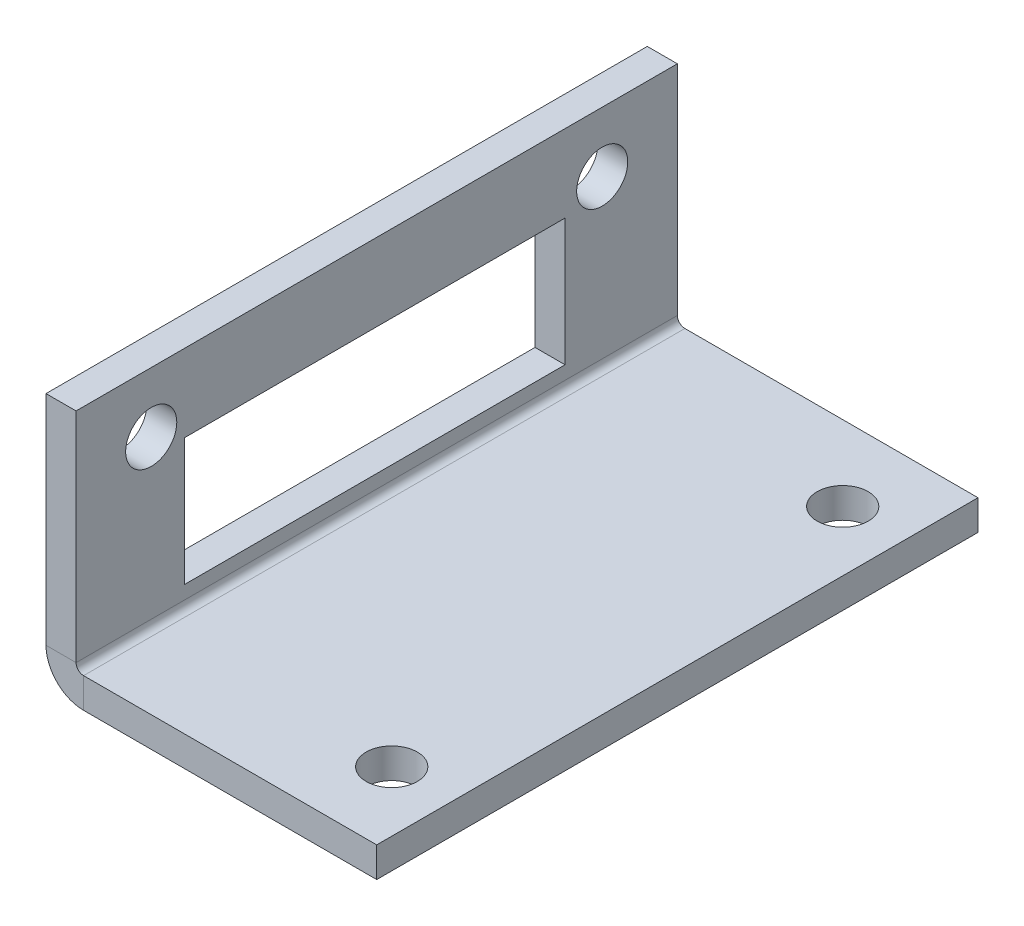
ISO-10303-21;
HEADER;
FILE_DESCRIPTION(('STEP AP214'),'2;1');
FILE_NAME('part.step','',(''),(''),'','','');
FILE_SCHEMA(('AUTOMOTIVE_DESIGN { 1 0 10303 214 1 1 1 1 }'));
ENDSEC;
DATA;
#1=APPLICATION_CONTEXT('core data for automotive mechanical design processes');
#2=APPLICATION_PROTOCOL_DEFINITION('international standard','automotive_design',2000,#1);
#3=PRODUCT_CONTEXT('',#1,'mechanical');
#4=PRODUCT('Part','Part','',(#3));
#5=PRODUCT_RELATED_PRODUCT_CATEGORY('part','',(#4));
#6=PRODUCT_DEFINITION_FORMATION('','',#4);
#7=PRODUCT_DEFINITION_CONTEXT('part definition',#1,'design');
#8=PRODUCT_DEFINITION('design','',#6,#7);
#9=PRODUCT_DEFINITION_SHAPE('','',#8);
#10=(LENGTH_UNIT() NAMED_UNIT(*) SI_UNIT(.MILLI.,.METRE.));
#11=(NAMED_UNIT(*) PLANE_ANGLE_UNIT() SI_UNIT($,.RADIAN.));
#12=(NAMED_UNIT(*) SI_UNIT($,.STERADIAN.) SOLID_ANGLE_UNIT());
#13=UNCERTAINTY_MEASURE_WITH_UNIT(LENGTH_MEASURE(1.E-05),#10,'distance_accuracy_value','');
#14=(GEOMETRIC_REPRESENTATION_CONTEXT(3) GLOBAL_UNCERTAINTY_ASSIGNED_CONTEXT((#13)) GLOBAL_UNIT_ASSIGNED_CONTEXT((#10,
#11,#12)) REPRESENTATION_CONTEXT('',''));
#15=CARTESIAN_POINT('',(0.,0.,0.));
#16=DIRECTION('',(0.,0.,1.));
#17=DIRECTION('',(1.,0.,0.));
#18=AXIS2_PLACEMENT_3D('',#15,#16,#17);
#19=CARTESIAN_POINT('',(0.5,0.,40.));
#20=DIRECTION('',(0.,0.,1.));
#21=DIRECTION('',(1.,0.,0.));
#22=AXIS2_PLACEMENT_3D('',#19,#20,#21);
#23=PLANE('',#22);
#24=DIRECTION('',(0.,-1.,0.));
#25=VECTOR('',#24,1.);
#26=CARTESIAN_POINT('',(0.5,0.,40.));
#27=LINE('',#26,#25);
#28=CARTESIAN_POINT('',(0.5,0.,40.));
#29=VERTEX_POINT('',#28);
#30=CARTESIAN_POINT('',(0.5,-2.,40.));
#31=VERTEX_POINT('',#30);
#32=EDGE_CURVE('E11',#29,#31,#27,.T.);
#33=ORIENTED_EDGE('',*,*,#32,.F.);
#34=CARTESIAN_POINT('',(0.5,0.5,40.));
#35=DIRECTION('',(0.,0.,-1.));
#36=DIRECTION('',(-1.,0.,0.));
#37=AXIS2_PLACEMENT_3D('',#34,#35,#36);
#38=CIRCLE('',#37,0.5);
#39=CARTESIAN_POINT('',(0.,0.5,40.));
#40=VERTEX_POINT('',#39);
#41=EDGE_CURVE('E192',#40,#29,#38,.F.);
#42=ORIENTED_EDGE('',*,*,#41,.F.);
#43=DIRECTION('',(1.,0.,0.));
#44=VECTOR('',#43,1.);
#45=CARTESIAN_POINT('',(-2.,0.5,40.));
#46=LINE('',#45,#44);
#47=CARTESIAN_POINT('',(-2.,0.5,40.));
#48=VERTEX_POINT('',#47);
#49=EDGE_CURVE('E48',#48,#40,#46,.T.);
#50=ORIENTED_EDGE('',*,*,#49,.F.);
#51=CARTESIAN_POINT('',(0.5,0.5,40.));
#52=DIRECTION('',(0.,0.,1.));
#53=DIRECTION('',(1.,0.,0.));
#54=AXIS2_PLACEMENT_3D('',#51,#52,#53);
#55=CIRCLE('',#54,2.5);
#56=EDGE_CURVE('E204',#48,#31,#55,.T.);
#57=ORIENTED_EDGE('',*,*,#56,.T.);
#58=EDGE_LOOP('',(#33,#42,#50,#57));
#59=FACE_BOUND('',#58,.T.);
#60=ADVANCED_FACE('F40',(#59),#23,.T.);
#61=CARTESIAN_POINT('',(-2.,0.5,40.));
#62=DIRECTION('',(0.,0.,1.));
#63=DIRECTION('',(1.,0.,0.));
#64=AXIS2_PLACEMENT_3D('',#61,#62,#63);
#65=PLANE('',#64);
#66=DIRECTION('',(1.,0.,0.));
#67=VECTOR('',#66,1.);
#68=CARTESIAN_POINT('',(0.,0.,40.));
#69=LINE('',#68,#67);
#70=CARTESIAN_POINT('',(20.,0.,40.));
#71=VERTEX_POINT('',#70);
#72=EDGE_CURVE('E189',#29,#71,#69,.T.);
#73=ORIENTED_EDGE('',*,*,#72,.F.);
#74=ORIENTED_EDGE('',*,*,#32,.T.);
#75=DIRECTION('',(1.,0.,0.));
#76=VECTOR('',#75,1.);
#77=CARTESIAN_POINT('',(0.,-2.,40.));
#78=LINE('',#77,#76);
#79=CARTESIAN_POINT('',(20.,-2.,40.));
#80=VERTEX_POINT('',#79);
#81=EDGE_CURVE('E183',#31,#80,#78,.T.);
#82=ORIENTED_EDGE('',*,*,#81,.T.);
#83=DIRECTION('',(0.,-1.,0.));
#84=VECTOR('',#83,1.);
#85=CARTESIAN_POINT('',(20.,0.,40.));
#86=LINE('',#85,#84);
#87=EDGE_CURVE('E185',#71,#80,#86,.T.);
#88=ORIENTED_EDGE('',*,*,#87,.F.);
#89=EDGE_LOOP('',(#73,#74,#82,#88));
#90=FACE_BOUND('',#89,.T.);
#91=ADVANCED_FACE('F277',(#90),#65,.T.);
#92=CARTESIAN_POINT('',(0.,0.5,0.));
#93=DIRECTION('',(0.,0.,-1.));
#94=DIRECTION('',(-1.,0.,0.));
#95=AXIS2_PLACEMENT_3D('',#92,#93,#94);
#96=PLANE('',#95);
#97=DIRECTION('',(-1.,0.,0.));
#98=VECTOR('',#97,1.);
#99=CARTESIAN_POINT('',(0.,0.5,0.));
#100=LINE('',#99,#98);
#101=CARTESIAN_POINT('',(0.,0.5,0.));
#102=VERTEX_POINT('',#101);
#103=CARTESIAN_POINT('',(-2.,0.5,0.));
#104=VERTEX_POINT('',#103);
#105=EDGE_CURVE('E252',#102,#104,#100,.T.);
#106=ORIENTED_EDGE('',*,*,#105,.F.);
#107=CARTESIAN_POINT('',(0.5,0.5,0.));
#108=DIRECTION('',(0.,0.,-1.));
#109=DIRECTION('',(-1.,0.,0.));
#110=AXIS2_PLACEMENT_3D('',#107,#108,#109);
#111=CIRCLE('',#110,0.5);
#112=CARTESIAN_POINT('',(0.5,0.,0.));
#113=VERTEX_POINT('',#112);
#114=EDGE_CURVE('E217',#102,#113,#111,.F.);
#115=ORIENTED_EDGE('',*,*,#114,.T.);
#116=DIRECTION('',(0.,1.,0.));
#117=VECTOR('',#116,1.);
#118=CARTESIAN_POINT('',(0.5,-2.,0.));
#119=LINE('',#118,#117);
#120=CARTESIAN_POINT('',(0.5,-2.,0.));
#121=VERTEX_POINT('',#120);
#122=EDGE_CURVE('E250',#121,#113,#119,.T.);
#123=ORIENTED_EDGE('',*,*,#122,.F.);
#124=CARTESIAN_POINT('',(0.5,0.5,0.));
#125=DIRECTION('',(0.,0.,1.));
#126=DIRECTION('',(1.,0.,0.));
#127=AXIS2_PLACEMENT_3D('',#124,#125,#126);
#128=CIRCLE('',#127,2.5);
#129=EDGE_CURVE('E186',#104,#121,#128,.T.);
#130=ORIENTED_EDGE('',*,*,#129,.F.);
#131=EDGE_LOOP('',(#106,#115,#123,#130));
#132=FACE_BOUND('',#131,.T.);
#133=ADVANCED_FACE('F282',(#132),#96,.T.);
#134=CARTESIAN_POINT('',(0.5,-2.,0.));
#135=DIRECTION('',(0.,0.,-1.));
#136=DIRECTION('',(-1.,0.,0.));
#137=AXIS2_PLACEMENT_3D('',#134,#135,#136);
#138=PLANE('',#137);
#139=DIRECTION('',(0.,-1.,0.));
#140=VECTOR('',#139,1.);
#141=CARTESIAN_POINT('',(0.,0.,0.));
#142=LINE('',#141,#140);
#143=CARTESIAN_POINT('',(0.,15.,0.));
#144=VERTEX_POINT('',#143);
#145=EDGE_CURVE('E220',#144,#102,#142,.T.);
#146=ORIENTED_EDGE('',*,*,#145,.T.);
#147=ORIENTED_EDGE('',*,*,#105,.T.);
#148=DIRECTION('',(0.,1.,0.));
#149=VECTOR('',#148,1.);
#150=CARTESIAN_POINT('',(-2.,0.,0.));
#151=LINE('',#150,#149);
#152=CARTESIAN_POINT('',(-2.,15.,0.));
#153=VERTEX_POINT('',#152);
#154=EDGE_CURVE('E226',#153,#104,#151,.F.);
#155=ORIENTED_EDGE('',*,*,#154,.F.);
#156=DIRECTION('',(1.,0.,0.));
#157=VECTOR('',#156,1.);
#158=CARTESIAN_POINT('',(-2.,15.,0.));
#159=LINE('',#158,#157);
#160=EDGE_CURVE('E223',#153,#144,#159,.T.);
#161=ORIENTED_EDGE('',*,*,#160,.T.);
#162=EDGE_LOOP('',(#146,#147,#155,#161));
#163=FACE_BOUND('',#162,.T.);
#164=ADVANCED_FACE('F325',(#163),#138,.T.);
#165=CARTESIAN_POINT('',(0.,-2.,40.));
#166=DIRECTION('',(0.,1.,0.));
#167=DIRECTION('',(0.,0.,1.));
#168=AXIS2_PLACEMENT_3D('',#165,#166,#167);
#169=PLANE('',#168);
#170=CARTESIAN_POINT('',(16.,-2.,5.));
#171=DIRECTION('',(0.,1.,0.));
#172=DIRECTION('',(0.,0.,1.));
#173=AXIS2_PLACEMENT_3D('',#170,#171,#172);
#174=CIRCLE('',#173,1.7);
#175=CARTESIAN_POINT('',(16.,-2.,6.7));
#176=VERTEX_POINT('',#175);
#177=EDGE_CURVE('E173',#176,#176,#174,.T.);
#178=ORIENTED_EDGE('',*,*,#177,.T.);
#179=EDGE_LOOP('',(#178));
#180=FACE_BOUND('',#179,.T.);
#181=CARTESIAN_POINT('',(16.,-2.,35.));
#182=DIRECTION('',(0.,1.,0.));
#183=DIRECTION('',(0.,0.,1.));
#184=AXIS2_PLACEMENT_3D('',#181,#182,#183);
#185=CIRCLE('',#184,1.7);
#186=CARTESIAN_POINT('',(16.,-2.,36.7));
#187=VERTEX_POINT('',#186);
#188=EDGE_CURVE('E168',#187,#187,#185,.T.);
#189=ORIENTED_EDGE('',*,*,#188,.T.);
#190=EDGE_LOOP('',(#189));
#191=FACE_BOUND('',#190,.T.);
#192=DIRECTION('',(1.,0.,0.));
#193=VECTOR('',#192,1.);
#194=CARTESIAN_POINT('',(0.,-2.,0.));
#195=LINE('',#194,#193);
#196=CARTESIAN_POINT('',(20.,-2.,0.));
#197=VERTEX_POINT('',#196);
#198=EDGE_CURVE('E208',#121,#197,#195,.T.);
#199=ORIENTED_EDGE('',*,*,#198,.T.);
#200=DIRECTION('',(0.,0.,-1.));
#201=VECTOR('',#200,1.);
#202=CARTESIAN_POINT('',(20.,-2.,40.));
#203=LINE('',#202,#201);
#204=EDGE_CURVE('E248',#80,#197,#203,.T.);
#205=ORIENTED_EDGE('',*,*,#204,.F.);
#206=ORIENTED_EDGE('',*,*,#81,.F.);
#207=DIRECTION('',(0.,0.,-1.));
#208=VECTOR('',#207,1.);
#209=CARTESIAN_POINT('',(0.5,-2.,40.));
#210=LINE('',#209,#208);
#211=EDGE_CURVE('E207',#31,#121,#210,.T.);
#212=ORIENTED_EDGE('',*,*,#211,.T.);
#213=EDGE_LOOP('',(#199,#205,#206,#212));
#214=FACE_BOUND('',#213,.T.);
#215=ADVANCED_FACE('F318',(#180,#191,#214),#169,.F.);
#216=CARTESIAN_POINT('',(20.,0.,40.));
#217=DIRECTION('',(1.,0.,0.));
#218=DIRECTION('',(0.,0.,-1.));
#219=AXIS2_PLACEMENT_3D('',#216,#217,#218);
#220=PLANE('',#219);
#221=DIRECTION('',(0.,-1.,0.));
#222=VECTOR('',#221,1.);
#223=CARTESIAN_POINT('',(20.,0.,0.));
#224=LINE('',#223,#222);
#225=CARTESIAN_POINT('',(20.,0.,0.));
#226=VERTEX_POINT('',#225);
#227=EDGE_CURVE('E211',#226,#197,#224,.T.);
#228=ORIENTED_EDGE('',*,*,#227,.F.);
#229=DIRECTION('',(0.,0.,-1.));
#230=VECTOR('',#229,1.);
#231=CARTESIAN_POINT('',(20.,0.,40.));
#232=LINE('',#231,#230);
#233=EDGE_CURVE('E246',#71,#226,#232,.T.);
#234=ORIENTED_EDGE('',*,*,#233,.F.);
#235=ORIENTED_EDGE('',*,*,#87,.T.);
#236=ORIENTED_EDGE('',*,*,#204,.T.);
#237=EDGE_LOOP('',(#228,#234,#235,#236));
#238=FACE_BOUND('',#237,.T.);
#239=ADVANCED_FACE('F321',(#238),#220,.T.);
#240=CARTESIAN_POINT('',(0.,0.,40.));
#241=DIRECTION('',(0.,1.,0.));
#242=DIRECTION('',(0.,0.,1.));
#243=AXIS2_PLACEMENT_3D('',#240,#241,#242);
#244=PLANE('',#243);
#245=CARTESIAN_POINT('',(16.,0.,5.));
#246=DIRECTION('',(0.,1.,0.));
#247=DIRECTION('',(0.,0.,1.));
#248=AXIS2_PLACEMENT_3D('',#245,#246,#247);
#249=CIRCLE('',#248,1.7);
#250=CARTESIAN_POINT('',(16.,0.,6.7));
#251=VERTEX_POINT('',#250);
#252=EDGE_CURVE('E165',#251,#251,#249,.T.);
#253=ORIENTED_EDGE('',*,*,#252,.F.);
#254=EDGE_LOOP('',(#253));
#255=FACE_BOUND('',#254,.T.);
#256=CARTESIAN_POINT('',(16.,0.,35.));
#257=DIRECTION('',(0.,1.,0.));
#258=DIRECTION('',(0.,0.,1.));
#259=AXIS2_PLACEMENT_3D('',#256,#257,#258);
#260=CIRCLE('',#259,1.7);
#261=CARTESIAN_POINT('',(16.,0.,36.7));
#262=VERTEX_POINT('',#261);
#263=EDGE_CURVE('E164',#262,#262,#260,.T.);
#264=ORIENTED_EDGE('',*,*,#263,.F.);
#265=EDGE_LOOP('',(#264));
#266=FACE_BOUND('',#265,.T.);
#267=DIRECTION('',(1.,0.,0.));
#268=VECTOR('',#267,1.);
#269=CARTESIAN_POINT('',(0.,0.,0.));
#270=LINE('',#269,#268);
#271=EDGE_CURVE('E214',#113,#226,#270,.T.);
#272=ORIENTED_EDGE('',*,*,#271,.F.);
#273=DIRECTION('',(0.,0.,-1.));
#274=VECTOR('',#273,1.);
#275=CARTESIAN_POINT('',(0.5,0.,40.));
#276=LINE('',#275,#274);
#277=EDGE_CURVE('E243',#29,#113,#276,.T.);
#278=ORIENTED_EDGE('',*,*,#277,.F.);
#279=ORIENTED_EDGE('',*,*,#72,.T.);
#280=ORIENTED_EDGE('',*,*,#233,.T.);
#281=EDGE_LOOP('',(#272,#278,#279,#280));
#282=FACE_BOUND('',#281,.T.);
#283=ADVANCED_FACE('F291',(#255,#266,#282),#244,.T.);
#284=CARTESIAN_POINT('',(0.5,0.5,40.));
#285=DIRECTION('',(0.,0.,-1.));
#286=DIRECTION('',(-1.,0.,0.));
#287=AXIS2_PLACEMENT_3D('',#284,#285,#286);
#288=CYLINDRICAL_SURFACE('',#287,0.5);
#289=ORIENTED_EDGE('',*,*,#114,.F.);
#290=DIRECTION('',(0.,0.,-1.));
#291=VECTOR('',#290,1.);
#292=CARTESIAN_POINT('',(0.,0.5,40.));
#293=LINE('',#292,#291);
#294=EDGE_CURVE('E240',#40,#102,#293,.T.);
#295=ORIENTED_EDGE('',*,*,#294,.F.);
#296=ORIENTED_EDGE('',*,*,#41,.T.);
#297=ORIENTED_EDGE('',*,*,#277,.T.);
#298=EDGE_LOOP('',(#289,#295,#296,#297));
#299=FACE_BOUND('',#298,.T.);
#300=ADVANCED_FACE('F296',(#299),#288,.F.);
#301=CARTESIAN_POINT('',(0.,0.,40.));
#302=DIRECTION('',(1.,0.,0.));
#303=DIRECTION('',(0.,0.,-1.));
#304=AXIS2_PLACEMENT_3D('',#301,#302,#303);
#305=PLANE('',#304);
#306=DIRECTION('',(0.,1.,0.));
#307=VECTOR('',#306,1.);
#308=CARTESIAN_POINT('',(0.,0.,7.47018496268329));
#309=LINE('',#308,#307);
#310=CARTESIAN_POINT('',(0.,1.39413824960621,7.47018496268329));
#311=VERTEX_POINT('',#310);
#312=CARTESIAN_POINT('',(0.,9.84835444165303,7.47018496268329));
#313=VERTEX_POINT('',#312);
#314=EDGE_CURVE('E162',#311,#313,#309,.T.);
#315=ORIENTED_EDGE('',*,*,#314,.F.);
#316=DIRECTION('',(0.,0.,-1.));
#317=VECTOR('',#316,1.);
#318=CARTESIAN_POINT('',(0.,1.39413824960621,40.));
#319=LINE('',#318,#317);
#320=CARTESIAN_POINT('',(0.,1.39413824960621,32.802531688673));
#321=VERTEX_POINT('',#320);
#322=EDGE_CURVE('E155',#321,#311,#319,.T.);
#323=ORIENTED_EDGE('',*,*,#322,.F.);
#324=DIRECTION('',(0.,-1.,0.));
#325=VECTOR('',#324,1.);
#326=CARTESIAN_POINT('',(0.,0.,32.802531688673));
#327=LINE('',#326,#325);
#328=CARTESIAN_POINT('',(0.,9.84835444165303,32.802531688673));
#329=VERTEX_POINT('',#328);
#330=EDGE_CURVE('E135',#329,#321,#327,.T.);
#331=ORIENTED_EDGE('',*,*,#330,.F.);
#332=DIRECTION('',(0.,0.,1.));
#333=VECTOR('',#332,1.);
#334=CARTESIAN_POINT('',(0.,9.84835444165303,40.));
#335=LINE('',#334,#333);
#336=EDGE_CURVE('E160',#313,#329,#335,.T.);
#337=ORIENTED_EDGE('',*,*,#336,.F.);
#338=EDGE_LOOP('',(#315,#323,#331,#337));
#339=FACE_BOUND('',#338,.T.);
#340=CARTESIAN_POINT('',(0.,11.,35.));
#341=DIRECTION('',(1.,0.,0.));
#342=DIRECTION('',(0.,0.,-1.));
#343=AXIS2_PLACEMENT_3D('',#340,#341,#342);
#344=CIRCLE('',#343,1.7);
#345=CARTESIAN_POINT('',(0.,11.,33.3));
#346=VERTEX_POINT('',#345);
#347=EDGE_CURVE('E177',#346,#346,#344,.T.);
#348=ORIENTED_EDGE('',*,*,#347,.F.);
#349=EDGE_LOOP('',(#348));
#350=FACE_BOUND('',#349,.T.);
#351=CARTESIAN_POINT('',(0.,11.,5.));
#352=DIRECTION('',(1.,0.,0.));
#353=DIRECTION('',(0.,0.,-1.));
#354=AXIS2_PLACEMENT_3D('',#351,#352,#353);
#355=CIRCLE('',#354,1.7);
#356=CARTESIAN_POINT('',(0.,11.,3.3));
#357=VERTEX_POINT('',#356);
#358=EDGE_CURVE('E176',#357,#357,#355,.T.);
#359=ORIENTED_EDGE('',*,*,#358,.F.);
#360=EDGE_LOOP('',(#359));
#361=FACE_BOUND('',#360,.T.);
#362=ORIENTED_EDGE('',*,*,#145,.F.);
#363=DIRECTION('',(0.,0.,-1.));
#364=VECTOR('',#363,1.);
#365=CARTESIAN_POINT('',(0.,15.,40.));
#366=LINE('',#365,#364);
#367=CARTESIAN_POINT('',(0.,15.,40.));
#368=VERTEX_POINT('',#367);
#369=EDGE_CURVE('E238',#368,#144,#366,.T.);
#370=ORIENTED_EDGE('',*,*,#369,.F.);
#371=DIRECTION('',(0.,-1.,0.));
#372=VECTOR('',#371,1.);
#373=CARTESIAN_POINT('',(0.,0.,40.));
#374=LINE('',#373,#372);
#375=EDGE_CURVE('E195',#368,#40,#374,.T.);
#376=ORIENTED_EDGE('',*,*,#375,.T.);
#377=ORIENTED_EDGE('',*,*,#294,.T.);
#378=EDGE_LOOP('',(#362,#370,#376,#377));
#379=FACE_BOUND('',#378,.T.);
#380=ADVANCED_FACE('F299',(#339,#350,#361,#379),#305,.T.);
#381=CARTESIAN_POINT('',(-2.,15.,40.));
#382=DIRECTION('',(0.,1.,0.));
#383=DIRECTION('',(0.,0.,1.));
#384=AXIS2_PLACEMENT_3D('',#381,#382,#383);
#385=PLANE('',#384);
#386=ORIENTED_EDGE('',*,*,#160,.F.);
#387=DIRECTION('',(0.,0.,-1.));
#388=VECTOR('',#387,1.);
#389=CARTESIAN_POINT('',(-2.,15.,40.));
#390=LINE('',#389,#388);
#391=CARTESIAN_POINT('',(-2.,15.,40.));
#392=VERTEX_POINT('',#391);
#393=EDGE_CURVE('E236',#392,#153,#390,.T.);
#394=ORIENTED_EDGE('',*,*,#393,.F.);
#395=DIRECTION('',(1.,0.,0.));
#396=VECTOR('',#395,1.);
#397=CARTESIAN_POINT('',(-2.,15.,40.));
#398=LINE('',#397,#396);
#399=EDGE_CURVE('E198',#392,#368,#398,.T.);
#400=ORIENTED_EDGE('',*,*,#399,.T.);
#401=ORIENTED_EDGE('',*,*,#369,.T.);
#402=EDGE_LOOP('',(#386,#394,#400,#401));
#403=FACE_BOUND('',#402,.T.);
#404=ADVANCED_FACE('F306',(#403),#385,.T.);
#405=CARTESIAN_POINT('',(-2.,0.,40.));
#406=DIRECTION('',(1.,0.,0.));
#407=DIRECTION('',(0.,0.,-1.));
#408=AXIS2_PLACEMENT_3D('',#405,#406,#407);
#409=PLANE('',#408);
#410=DIRECTION('',(0.,0.,1.));
#411=VECTOR('',#410,1.);
#412=CARTESIAN_POINT('',(-2.,1.39413824960621,7.47018496268329));
#413=LINE('',#412,#411);
#414=CARTESIAN_POINT('',(-2.,1.39413824960621,7.47018496268329));
#415=VERTEX_POINT('',#414);
#416=CARTESIAN_POINT('',(-2.,1.39413824960621,32.802531688673));
#417=VERTEX_POINT('',#416);
#418=EDGE_CURVE('E141',#415,#417,#413,.T.);
#419=ORIENTED_EDGE('',*,*,#418,.F.);
#420=DIRECTION('',(0.,-1.,0.));
#421=VECTOR('',#420,1.);
#422=CARTESIAN_POINT('',(-2.,9.84835444165303,7.47018496268329));
#423=LINE('',#422,#421);
#424=CARTESIAN_POINT('',(-2.,9.84835444165303,7.47018496268329));
#425=VERTEX_POINT('',#424);
#426=EDGE_CURVE('E64',#425,#415,#423,.T.);
#427=ORIENTED_EDGE('',*,*,#426,.F.);
#428=DIRECTION('',(0.,0.,-1.));
#429=VECTOR('',#428,1.);
#430=CARTESIAN_POINT('',(-2.,9.84835444165303,7.47018496268329));
#431=LINE('',#430,#429);
#432=CARTESIAN_POINT('',(-2.,9.84835444165303,32.802531688673));
#433=VERTEX_POINT('',#432);
#434=EDGE_CURVE('E148',#433,#425,#431,.T.);
#435=ORIENTED_EDGE('',*,*,#434,.F.);
#436=DIRECTION('',(0.,1.,0.));
#437=VECTOR('',#436,1.);
#438=CARTESIAN_POINT('',(-2.,9.84835444165303,32.802531688673));
#439=LINE('',#438,#437);
#440=EDGE_CURVE('E132',#417,#433,#439,.T.);
#441=ORIENTED_EDGE('',*,*,#440,.F.);
#442=EDGE_LOOP('',(#419,#427,#435,#441));
#443=FACE_BOUND('',#442,.T.);
#444=CARTESIAN_POINT('',(-2.,11.,35.));
#445=DIRECTION('',(1.,0.,0.));
#446=DIRECTION('',(0.,0.,-1.));
#447=AXIS2_PLACEMENT_3D('',#444,#445,#446);
#448=CIRCLE('',#447,1.7);
#449=CARTESIAN_POINT('',(-2.,11.,33.3));
#450=VERTEX_POINT('',#449);
#451=EDGE_CURVE('E43',#450,#450,#448,.T.);
#452=ORIENTED_EDGE('',*,*,#451,.T.);
#453=EDGE_LOOP('',(#452));
#454=FACE_BOUND('',#453,.T.);
#455=CARTESIAN_POINT('',(-2.,11.,5.));
#456=DIRECTION('',(1.,0.,0.));
#457=DIRECTION('',(0.,0.,-1.));
#458=AXIS2_PLACEMENT_3D('',#455,#456,#457);
#459=CIRCLE('',#458,1.7);
#460=CARTESIAN_POINT('',(-2.,11.,3.3));
#461=VERTEX_POINT('',#460);
#462=EDGE_CURVE('E180',#461,#461,#459,.T.);
#463=ORIENTED_EDGE('',*,*,#462,.T.);
#464=EDGE_LOOP('',(#463));
#465=FACE_BOUND('',#464,.T.);
#466=ORIENTED_EDGE('',*,*,#154,.T.);
#467=DIRECTION('',(0.,0.,-1.));
#468=VECTOR('',#467,1.);
#469=CARTESIAN_POINT('',(-2.,0.5,40.));
#470=LINE('',#469,#468);
#471=EDGE_CURVE('E233',#48,#104,#470,.T.);
#472=ORIENTED_EDGE('',*,*,#471,.F.);
#473=DIRECTION('',(0.,1.,0.));
#474=VECTOR('',#473,1.);
#475=CARTESIAN_POINT('',(-2.,0.,40.));
#476=LINE('',#475,#474);
#477=EDGE_CURVE('E201',#392,#48,#476,.F.);
#478=ORIENTED_EDGE('',*,*,#477,.F.);
#479=ORIENTED_EDGE('',*,*,#393,.T.);
#480=EDGE_LOOP('',(#466,#472,#478,#479));
#481=FACE_BOUND('',#480,.T.);
#482=ADVANCED_FACE('F145',(#443,#454,#465,#481),#409,.F.);
#483=CARTESIAN_POINT('',(0.5,0.5,40.));
#484=DIRECTION('',(0.,0.,-1.));
#485=DIRECTION('',(-1.,0.,0.));
#486=AXIS2_PLACEMENT_3D('',#483,#484,#485);
#487=CYLINDRICAL_SURFACE('',#486,2.5);
#488=ORIENTED_EDGE('',*,*,#129,.T.);
#489=ORIENTED_EDGE('',*,*,#211,.F.);
#490=ORIENTED_EDGE('',*,*,#56,.F.);
#491=ORIENTED_EDGE('',*,*,#471,.T.);
#492=EDGE_LOOP('',(#488,#489,#490,#491));
#493=FACE_BOUND('',#492,.T.);
#494=ADVANCED_FACE('F313',(#493),#487,.T.);
#495=CARTESIAN_POINT('',(0.5,0.5,40.));
#496=DIRECTION('',(0.,0.,-1.));
#497=DIRECTION('',(-1.,0.,0.));
#498=AXIS2_PLACEMENT_3D('',#495,#496,#497);
#499=PLANE('',#498);
#500=ORIENTED_EDGE('',*,*,#477,.T.);
#501=ORIENTED_EDGE('',*,*,#49,.T.);
#502=ORIENTED_EDGE('',*,*,#375,.F.);
#503=ORIENTED_EDGE('',*,*,#399,.F.);
#504=EDGE_LOOP('',(#500,#501,#502,#503));
#505=FACE_BOUND('',#504,.T.);
#506=ADVANCED_FACE('F303',(#505),#499,.F.);
#507=CARTESIAN_POINT('',(0.5,0.5,0.));
#508=DIRECTION('',(0.,0.,-1.));
#509=DIRECTION('',(-1.,0.,0.));
#510=AXIS2_PLACEMENT_3D('',#507,#508,#509);
#511=PLANE('',#510);
#512=ORIENTED_EDGE('',*,*,#198,.F.);
#513=ORIENTED_EDGE('',*,*,#122,.T.);
#514=ORIENTED_EDGE('',*,*,#271,.T.);
#515=ORIENTED_EDGE('',*,*,#227,.T.);
#516=EDGE_LOOP('',(#512,#513,#514,#515));
#517=FACE_BOUND('',#516,.T.);
#518=ADVANCED_FACE('F273',(#517),#511,.T.);
#519=CARTESIAN_POINT('',(-10.,11.,5.));
#520=DIRECTION('',(1.,0.,0.));
#521=DIRECTION('',(0.,0.,-1.));
#522=AXIS2_PLACEMENT_3D('',#519,#520,#521);
#523=CYLINDRICAL_SURFACE('',#522,1.7);
#524=ORIENTED_EDGE('',*,*,#358,.T.);
#525=EDGE_LOOP('',(#524));
#526=FACE_BOUND('',#525,.T.);
#527=ORIENTED_EDGE('',*,*,#462,.F.);
#528=EDGE_LOOP('',(#527));
#529=FACE_BOUND('',#528,.T.);
#530=ADVANCED_FACE('F263',(#526,#529),#523,.F.);
#531=CARTESIAN_POINT('',(-10.,11.,35.));
#532=DIRECTION('',(1.,0.,0.));
#533=DIRECTION('',(0.,0.,-1.));
#534=AXIS2_PLACEMENT_3D('',#531,#532,#533);
#535=CYLINDRICAL_SURFACE('',#534,1.7);
#536=ORIENTED_EDGE('',*,*,#347,.T.);
#537=EDGE_LOOP('',(#536));
#538=FACE_BOUND('',#537,.T.);
#539=ORIENTED_EDGE('',*,*,#451,.F.);
#540=EDGE_LOOP('',(#539));
#541=FACE_BOUND('',#540,.T.);
#542=ADVANCED_FACE('F260',(#538,#541),#535,.F.);
#543=CARTESIAN_POINT('',(16.,-10.,35.));
#544=DIRECTION('',(0.,1.,0.));
#545=DIRECTION('',(0.,0.,1.));
#546=AXIS2_PLACEMENT_3D('',#543,#544,#545);
#547=CYLINDRICAL_SURFACE('',#546,1.7);
#548=ORIENTED_EDGE('',*,*,#263,.T.);
#549=EDGE_LOOP('',(#548));
#550=FACE_BOUND('',#549,.T.);
#551=ORIENTED_EDGE('',*,*,#188,.F.);
#552=EDGE_LOOP('',(#551));
#553=FACE_BOUND('',#552,.T.);
#554=ADVANCED_FACE('F262',(#550,#553),#547,.F.);
#555=CARTESIAN_POINT('',(16.,-10.,5.));
#556=DIRECTION('',(0.,1.,0.));
#557=DIRECTION('',(0.,0.,1.));
#558=AXIS2_PLACEMENT_3D('',#555,#556,#557);
#559=CYLINDRICAL_SURFACE('',#558,1.7);
#560=ORIENTED_EDGE('',*,*,#252,.T.);
#561=EDGE_LOOP('',(#560));
#562=FACE_BOUND('',#561,.T.);
#563=ORIENTED_EDGE('',*,*,#177,.F.);
#564=EDGE_LOOP('',(#563));
#565=FACE_BOUND('',#564,.T.);
#566=ADVANCED_FACE('F270',(#562,#565),#559,.F.);
#567=CARTESIAN_POINT('',(8.,9.84835444165303,7.47018496268329));
#568=DIRECTION('',(0.,0.,-1.));
#569=DIRECTION('',(-1.,0.,0.));
#570=AXIS2_PLACEMENT_3D('',#567,#568,#569);
#571=PLANE('',#570);
#572=ORIENTED_EDGE('',*,*,#314,.T.);
#573=DIRECTION('',(-1.,0.,0.));
#574=VECTOR('',#573,1.);
#575=CARTESIAN_POINT('',(8.,9.84835444165303,7.47018496268329));
#576=LINE('',#575,#574);
#577=EDGE_CURVE('E153',#313,#425,#576,.T.);
#578=ORIENTED_EDGE('',*,*,#577,.T.);
#579=ORIENTED_EDGE('',*,*,#426,.T.);
#580=DIRECTION('',(-1.,0.,0.));
#581=VECTOR('',#580,1.);
#582=CARTESIAN_POINT('',(8.,1.39413824960621,7.47018496268329));
#583=LINE('',#582,#581);
#584=EDGE_CURVE('E138',#311,#415,#583,.T.);
#585=ORIENTED_EDGE('',*,*,#584,.F.);
#586=EDGE_LOOP('',(#572,#578,#579,#585));
#587=FACE_BOUND('',#586,.T.);
#588=ADVANCED_FACE('F406',(#587),#571,.F.);
#589=CARTESIAN_POINT('',(8.,9.84835444165303,7.47018496268329));
#590=DIRECTION('',(0.,1.,0.));
#591=DIRECTION('',(0.,0.,1.));
#592=AXIS2_PLACEMENT_3D('',#589,#590,#591);
#593=PLANE('',#592);
#594=ORIENTED_EDGE('',*,*,#336,.T.);
#595=DIRECTION('',(-1.,0.,0.));
#596=VECTOR('',#595,1.);
#597=CARTESIAN_POINT('',(8.,9.84835444165303,32.802531688673));
#598=LINE('',#597,#596);
#599=EDGE_CURVE('E137',#329,#433,#598,.T.);
#600=ORIENTED_EDGE('',*,*,#599,.T.);
#601=ORIENTED_EDGE('',*,*,#434,.T.);
#602=ORIENTED_EDGE('',*,*,#577,.F.);
#603=EDGE_LOOP('',(#594,#600,#601,#602));
#604=FACE_BOUND('',#603,.T.);
#605=ADVANCED_FACE('F433',(#604),#593,.F.);
#606=CARTESIAN_POINT('',(8.,9.84835444165303,32.802531688673));
#607=DIRECTION('',(0.,0.,1.));
#608=DIRECTION('',(1.,0.,0.));
#609=AXIS2_PLACEMENT_3D('',#606,#607,#608);
#610=PLANE('',#609);
#611=ORIENTED_EDGE('',*,*,#330,.T.);
#612=DIRECTION('',(-1.,0.,0.));
#613=VECTOR('',#612,1.);
#614=CARTESIAN_POINT('',(8.,1.39413824960621,32.802531688673));
#615=LINE('',#614,#613);
#616=EDGE_CURVE('E56',#321,#417,#615,.T.);
#617=ORIENTED_EDGE('',*,*,#616,.T.);
#618=ORIENTED_EDGE('',*,*,#440,.T.);
#619=ORIENTED_EDGE('',*,*,#599,.F.);
#620=EDGE_LOOP('',(#611,#617,#618,#619));
#621=FACE_BOUND('',#620,.T.);
#622=ADVANCED_FACE('F129',(#621),#610,.F.);
#623=CARTESIAN_POINT('',(8.,1.39413824960621,7.47018496268329));
#624=DIRECTION('',(0.,-1.,0.));
#625=DIRECTION('',(0.,0.,-1.));
#626=AXIS2_PLACEMENT_3D('',#623,#624,#625);
#627=PLANE('',#626);
#628=ORIENTED_EDGE('',*,*,#322,.T.);
#629=ORIENTED_EDGE('',*,*,#584,.T.);
#630=ORIENTED_EDGE('',*,*,#418,.T.);
#631=ORIENTED_EDGE('',*,*,#616,.F.);
#632=EDGE_LOOP('',(#628,#629,#630,#631));
#633=FACE_BOUND('',#632,.T.);
#634=ADVANCED_FACE('F142',(#633),#627,.F.);
#635=CLOSED_SHELL('',(#60,#91,#133,#164,#215,#239,#283,#300,#380,#404,#482,#494,#506,#518,#530,
#542,#554,#566,#588,#605,#622,#634));
#636=MANIFOLD_SOLID_BREP('B2',#635);
#637=ADVANCED_BREP_SHAPE_REPRESENTATION('',(#18,#636),#14);
#638=SHAPE_DEFINITION_REPRESENTATION(#9,#637);
ENDSEC;
END-ISO-10303-21;
